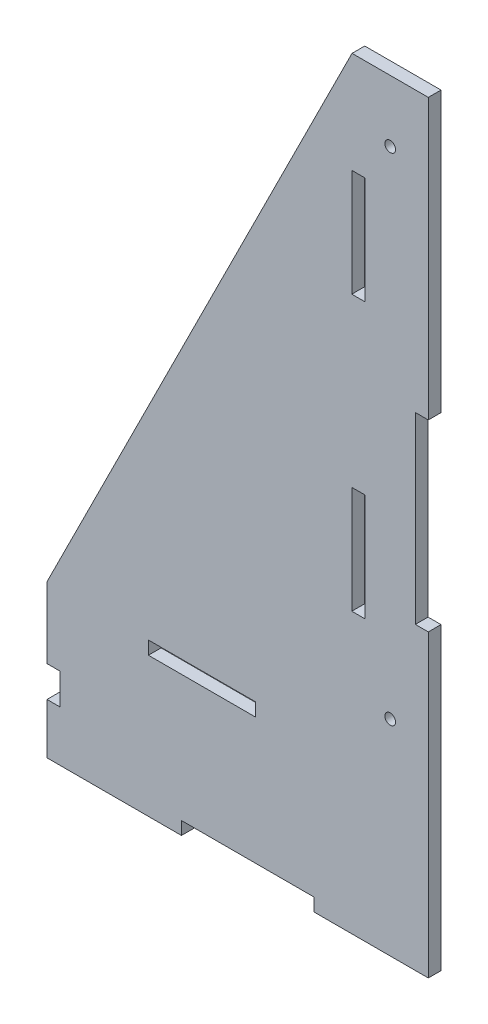
ISO-10303-21;
HEADER;
FILE_DESCRIPTION(('STEP AP214'),'2;1');
FILE_NAME('part.step','',(''),(''),'','','');
FILE_SCHEMA(('AUTOMOTIVE_DESIGN { 1 0 10303 214 1 1 1 1 }'));
ENDSEC;
DATA;
#1=APPLICATION_CONTEXT('core data for automotive mechanical design processes');
#2=APPLICATION_PROTOCOL_DEFINITION('international standard','automotive_design',2000,#1);
#3=PRODUCT_CONTEXT('',#1,'mechanical');
#4=PRODUCT('Part','Part','',(#3));
#5=PRODUCT_RELATED_PRODUCT_CATEGORY('part','',(#4));
#6=PRODUCT_DEFINITION_FORMATION('','',#4);
#7=PRODUCT_DEFINITION_CONTEXT('part definition',#1,'design');
#8=PRODUCT_DEFINITION('design','',#6,#7);
#9=PRODUCT_DEFINITION_SHAPE('','',#8);
#10=(LENGTH_UNIT() NAMED_UNIT(*) SI_UNIT(.MILLI.,.METRE.));
#11=(NAMED_UNIT(*) PLANE_ANGLE_UNIT() SI_UNIT($,.RADIAN.));
#12=(NAMED_UNIT(*) SI_UNIT($,.STERADIAN.) SOLID_ANGLE_UNIT());
#13=UNCERTAINTY_MEASURE_WITH_UNIT(LENGTH_MEASURE(1.E-05),#10,'distance_accuracy_value','');
#14=(GEOMETRIC_REPRESENTATION_CONTEXT(3) GLOBAL_UNCERTAINTY_ASSIGNED_CONTEXT((#13)) GLOBAL_UNIT_ASSIGNED_CONTEXT((#10,
#11,#12)) REPRESENTATION_CONTEXT('',''));
#15=CARTESIAN_POINT('',(0.,0.,0.));
#16=DIRECTION('',(0.,0.,1.));
#17=DIRECTION('',(1.,0.,0.));
#18=AXIS2_PLACEMENT_3D('',#15,#16,#17);
#19=CARTESIAN_POINT('',(0.,0.,5.));
#20=DIRECTION('',(0.,0.,1.));
#21=DIRECTION('',(1.,0.,0.));
#22=AXIS2_PLACEMENT_3D('',#19,#20,#21);
#23=PLANE('',#22);
#24=CARTESIAN_POINT('',(-15.,-24.2230161128112,5.));
#25=DIRECTION('',(0.,0.,1.));
#26=DIRECTION('',(1.,0.,0.));
#27=AXIS2_PLACEMENT_3D('',#24,#25,#26);
#28=CIRCLE('',#27,2.1);
#29=CARTESIAN_POINT('',(-12.9,-24.2230161128112,5.));
#30=VERTEX_POINT('',#29);
#31=EDGE_CURVE('E267',#30,#30,#28,.T.);
#32=ORIENTED_EDGE('',*,*,#31,.F.);
#33=EDGE_LOOP('',(#32));
#34=FACE_BOUND('',#33,.T.);
#35=CARTESIAN_POINT('',(-15.,-219.269594776355,5.));
#36=DIRECTION('',(0.,0.,1.));
#37=DIRECTION('',(1.,0.,0.));
#38=AXIS2_PLACEMENT_3D('',#35,#36,#37);
#39=CIRCLE('',#38,2.1);
#40=CARTESIAN_POINT('',(-12.9,-219.269594776355,5.));
#41=VERTEX_POINT('',#40);
#42=EDGE_CURVE('E271',#41,#41,#39,.T.);
#43=ORIENTED_EDGE('',*,*,#42,.F.);
#44=EDGE_LOOP('',(#43));
#45=FACE_BOUND('',#44,.T.);
#46=CARTESIAN_POINT('',(-110.099999999999,-239.899999999994,4.99999999999873));
#47=CARTESIAN_POINT('',(-110.099999999999,-245.099999999994,4.99999999999873));
#48=B_SPLINE_CURVE_WITH_KNOTS('',1,(#46,#47),.UNSPECIFIED.,.F.,.F.,(2,2),(0.,
0.0548523206751055),.UNSPECIFIED.);
#49=CARTESIAN_POINT('',(-110.099999999999,-239.899999999994,4.99999999999873));
#50=VERTEX_POINT('',#49);
#51=CARTESIAN_POINT('',(-110.099999999999,-245.099999999994,5.));
#52=VERTEX_POINT('',#51);
#53=EDGE_CURVE('E303',#50,#52,#48,.T.);
#54=ORIENTED_EDGE('',*,*,#53,.F.);
#55=CARTESIAN_POINT('',(-67.8999999999994,-239.899999999995,4.99999999999884));
#56=CARTESIAN_POINT('',(-110.099999999999,-239.899999999994,4.99999999999873));
#57=B_SPLINE_CURVE_WITH_KNOTS('',1,(#55,#56),.UNSPECIFIED.,.F.,.F.,(2,2),(0.554852320675105,1.),.UNSPECIFIED.);
#58=CARTESIAN_POINT('',(-67.8999999999994,-239.899999999995,4.99999999999884));
#59=VERTEX_POINT('',#58);
#60=EDGE_CURVE('E338',#59,#50,#57,.T.);
#61=ORIENTED_EDGE('',*,*,#60,.F.);
#62=CARTESIAN_POINT('',(-67.8999999999995,-245.099999999995,4.99999999999884));
#63=CARTESIAN_POINT('',(-67.8999999999994,-239.899999999995,4.99999999999884));
#64=B_SPLINE_CURVE_WITH_KNOTS('',1,(#62,#63),.UNSPECIFIED.,.F.,.F.,(2,2),(0.5,
0.554852320675105),.UNSPECIFIED.);
#65=CARTESIAN_POINT('',(-67.8999999999995,-245.099999999995,4.99999999999884));
#66=VERTEX_POINT('',#65);
#67=EDGE_CURVE('E330',#66,#59,#64,.T.);
#68=ORIENTED_EDGE('',*,*,#67,.F.);
#69=CARTESIAN_POINT('',(-110.099999999999,-245.099999999994,4.99999999999873));
#70=CARTESIAN_POINT('',(-67.8999999999995,-245.099999999995,4.99999999999884));
#71=B_SPLINE_CURVE_WITH_KNOTS('',1,(#69,#70),.UNSPECIFIED.,.F.,.F.,(2,2),(0.0548523206751055,
0.5),.UNSPECIFIED.);
#72=EDGE_CURVE('E322',#52,#66,#71,.T.);
#73=ORIENTED_EDGE('',*,*,#72,.F.);
#74=EDGE_LOOP('',(#54,#61,#68,#73));
#75=FACE_BOUND('',#74,.T.);
#76=CARTESIAN_POINT('',(-30.0999999999972,-82.0999999999957,5.00000000000056));
#77=CARTESIAN_POINT('',(-24.8999999999972,-82.0999999999958,5.00000000000056));
#78=B_SPLINE_CURVE_WITH_KNOTS('',1,(#76,#77),.UNSPECIFIED.,.F.,.F.,(2,2),(0.,
0.0548523206751055),.UNSPECIFIED.);
#79=CARTESIAN_POINT('',(-30.0999999999972,-82.0999999999957,5.00000000000056));
#80=VERTEX_POINT('',#79);
#81=CARTESIAN_POINT('',(-24.8999999999972,-82.0999999999958,5.));
#82=VERTEX_POINT('',#81);
#83=EDGE_CURVE('E368',#80,#82,#78,.T.);
#84=ORIENTED_EDGE('',*,*,#83,.F.);
#85=CARTESIAN_POINT('',(-30.0999999999966,-39.8999999999957,5.00000000000056));
#86=CARTESIAN_POINT('',(-30.0999999999972,-82.0999999999957,5.00000000000056));
#87=B_SPLINE_CURVE_WITH_KNOTS('',1,(#85,#86),.UNSPECIFIED.,.F.,.F.,(2,2),(0.554852320675105,1.),.UNSPECIFIED.);
#88=CARTESIAN_POINT('',(-30.0999999999966,-39.8999999999957,5.00000000000056));
#89=VERTEX_POINT('',#88);
#90=EDGE_CURVE('E389',#89,#80,#87,.T.);
#91=ORIENTED_EDGE('',*,*,#90,.F.);
#92=CARTESIAN_POINT('',(-24.8999999999966,-39.8999999999958,5.00000000000056));
#93=CARTESIAN_POINT('',(-30.0999999999966,-39.8999999999957,5.00000000000056));
#94=B_SPLINE_CURVE_WITH_KNOTS('',1,(#92,#93),.UNSPECIFIED.,.F.,.F.,(2,2),(0.5,
0.554852320675105),.UNSPECIFIED.);
#95=CARTESIAN_POINT('',(-24.8999999999966,-39.8999999999958,5.00000000000056));
#96=VERTEX_POINT('',#95);
#97=EDGE_CURVE('E381',#96,#89,#94,.T.);
#98=ORIENTED_EDGE('',*,*,#97,.F.);
#99=CARTESIAN_POINT('',(-24.8999999999972,-82.0999999999958,5.00000000000056));
#100=CARTESIAN_POINT('',(-24.8999999999966,-39.8999999999958,5.00000000000056));
#101=B_SPLINE_CURVE_WITH_KNOTS('',1,(#99,#100),.UNSPECIFIED.,.F.,.F.,(2,2),(0.0548523206751055,
0.5),.UNSPECIFIED.);
#102=EDGE_CURVE('E372',#82,#96,#101,.T.);
#103=ORIENTED_EDGE('',*,*,#102,.F.);
#104=EDGE_LOOP('',(#84,#91,#98,#103));
#105=FACE_BOUND('',#104,.T.);
#106=CARTESIAN_POINT('',(-30.0999999999987,-190.099999999996,5.00000000000056));
#107=CARTESIAN_POINT('',(-24.8999999999987,-190.099999999996,5.00000000000056));
#108=B_SPLINE_CURVE_WITH_KNOTS('',1,(#106,#107),.UNSPECIFIED.,.F.,.F.,(2,2),(0.,
0.0548523206751055),.UNSPECIFIED.);
#109=CARTESIAN_POINT('',(-30.0999999999987,-190.099999999996,5.00000000000056));
#110=VERTEX_POINT('',#109);
#111=CARTESIAN_POINT('',(-24.8999999999987,-190.099999999996,5.));
#112=VERTEX_POINT('',#111);
#113=EDGE_CURVE('E358',#110,#112,#108,.T.);
#114=ORIENTED_EDGE('',*,*,#113,.F.);
#115=CARTESIAN_POINT('',(-30.0999999999982,-147.899999999996,5.00000000000056));
#116=CARTESIAN_POINT('',(-30.0999999999987,-190.099999999996,5.00000000000056));
#117=B_SPLINE_CURVE_WITH_KNOTS('',1,(#115,#116),.UNSPECIFIED.,.F.,.F.,(2,2),(0.554852320675105,
1.),.UNSPECIFIED.);
#118=CARTESIAN_POINT('',(-30.0999999999982,-147.899999999996,5.00000000000056));
#119=VERTEX_POINT('',#118);
#120=EDGE_CURVE('E437',#119,#110,#117,.T.);
#121=ORIENTED_EDGE('',*,*,#120,.F.);
#122=CARTESIAN_POINT('',(-24.8999999999982,-147.899999999996,5.00000000000056));
#123=CARTESIAN_POINT('',(-30.0999999999982,-147.899999999996,5.00000000000056));
#124=B_SPLINE_CURVE_WITH_KNOTS('',1,(#122,#123),.UNSPECIFIED.,.F.,.F.,(2,2),(0.5,
0.554852320675105),.UNSPECIFIED.);
#125=CARTESIAN_POINT('',(-24.8999999999982,-147.899999999996,5.00000000000056));
#126=VERTEX_POINT('',#125);
#127=EDGE_CURVE('E429',#126,#119,#124,.T.);
#128=ORIENTED_EDGE('',*,*,#127,.F.);
#129=CARTESIAN_POINT('',(-24.8999999999987,-190.099999999996,5.00000000000056));
#130=CARTESIAN_POINT('',(-24.8999999999982,-147.899999999996,5.00000000000056));
#131=B_SPLINE_CURVE_WITH_KNOTS('',1,(#129,#130),.UNSPECIFIED.,.F.,.F.,(2,2),(0.0548523206751055,
0.5),.UNSPECIFIED.);
#132=EDGE_CURVE('E421',#112,#126,#131,.T.);
#133=ORIENTED_EDGE('',*,*,#132,.F.);
#134=EDGE_LOOP('',(#114,#121,#128,#133));
#135=FACE_BOUND('',#134,.T.);
#136=DIRECTION('',(1.,0.,0.));
#137=VECTOR('',#136,1.);
#138=CARTESIAN_POINT('',(-150.,-300.,5.));
#139=LINE('',#138,#137);
#140=CARTESIAN_POINT('',(-150.,-300.,5.));
#141=VERTEX_POINT('',#140);
#142=CARTESIAN_POINT('',(-97.1000000000003,-300.,4.99999999999695));
#143=VERTEX_POINT('',#142);
#144=EDGE_CURVE('E247',#141,#143,#139,.T.);
#145=ORIENTED_EDGE('',*,*,#144,.T.);
#146=CARTESIAN_POINT('',(-97.1000000000003,-300.099999999995,4.99999999999695));
#147=CARTESIAN_POINT('',(-97.1000000000002,-294.899999999995,4.99999999999695));
#148=B_SPLINE_CURVE_WITH_KNOTS('',1,(#146,#147),.UNSPECIFIED.,.F.,.F.,(2,2),(0.5,
0.545296167247387),.UNSPECIFIED.);
#149=CARTESIAN_POINT('',(-97.1000000000002,-294.899999999995,4.99999999999695));
#150=VERTEX_POINT('',#149);
#151=EDGE_CURVE('E229',#143,#150,#148,.T.);
#152=ORIENTED_EDGE('',*,*,#151,.T.);
#153=CARTESIAN_POINT('',(-97.1000000000002,-294.899999999995,4.99999999999695));
#154=CARTESIAN_POINT('',(-44.9000000000002,-294.899999999995,4.99999999999712));
#155=B_SPLINE_CURVE_WITH_KNOTS('',1,(#153,#154),.UNSPECIFIED.,.F.,.F.,(2,2),(0.545296167247387,
1.),.UNSPECIFIED.);
#156=CARTESIAN_POINT('',(-44.9000000000002,-294.899999999995,4.99999999999712));
#157=VERTEX_POINT('',#156);
#158=EDGE_CURVE('E239',#150,#157,#155,.T.);
#159=ORIENTED_EDGE('',*,*,#158,.T.);
#160=CARTESIAN_POINT('',(-44.9000000000002,-294.899999999995,4.99999999999712));
#161=CARTESIAN_POINT('',(-44.9000000000003,-300.099999999995,4.99999999999712));
#162=B_SPLINE_CURVE_WITH_KNOTS('',1,(#160,#161),.UNSPECIFIED.,.F.,.F.,(2,2),(0.,
0.0452961672473868),.UNSPECIFIED.);
#163=CARTESIAN_POINT('',(-44.9000000000003,-300.,4.99999999999712));
#164=VERTEX_POINT('',#163);
#165=EDGE_CURVE('E248',#157,#164,#162,.T.);
#166=ORIENTED_EDGE('',*,*,#165,.T.);
#167=CARTESIAN_POINT('',(0.,-300.,5.));
#168=VERTEX_POINT('',#167);
#169=EDGE_CURVE('E500',#164,#168,#139,.T.);
#170=ORIENTED_EDGE('',*,*,#169,.T.);
#171=DIRECTION('',(0.,1.,0.));
#172=VECTOR('',#171,1.);
#173=CARTESIAN_POINT('',(0.,-300.,5.));
#174=LINE('',#173,#172);
#175=CARTESIAN_POINT('',(0.,-182.1,5.));
#176=VERTEX_POINT('',#175);
#177=EDGE_CURVE('E488',#168,#176,#174,.T.);
#178=ORIENTED_EDGE('',*,*,#177,.T.);
#179=DIRECTION('',(1.,0.,0.));
#180=VECTOR('',#179,1.);
#181=CARTESIAN_POINT('',(-5.10000000000251,-182.1,5.));
#182=LINE('',#181,#180);
#183=CARTESIAN_POINT('',(-5.10000000000253,-182.1,5.00000000000001));
#184=VERTEX_POINT('',#183);
#185=EDGE_CURVE('E58',#184,#176,#182,.T.);
#186=ORIENTED_EDGE('',*,*,#185,.F.);
#187=DIRECTION('',(0.,-1.,0.));
#188=VECTOR('',#187,1.);
#189=CARTESIAN_POINT('',(-5.10000000000152,-109.9,5.));
#190=LINE('',#189,#188);
#191=CARTESIAN_POINT('',(-5.10000000000152,-109.9,5.));
#192=VERTEX_POINT('',#191);
#193=EDGE_CURVE('E304',#192,#184,#190,.T.);
#194=ORIENTED_EDGE('',*,*,#193,.F.);
#195=DIRECTION('',(-1.,0.,0.));
#196=VECTOR('',#195,1.);
#197=CARTESIAN_POINT('',(0.0999999999984988,-109.9,5.));
#198=LINE('',#197,#196);
#199=CARTESIAN_POINT('',(0.,-109.9,5.));
#200=VERTEX_POINT('',#199);
#201=EDGE_CURVE('E279',#200,#192,#198,.T.);
#202=ORIENTED_EDGE('',*,*,#201,.F.);
#203=CARTESIAN_POINT('',(0.,0.,5.));
#204=VERTEX_POINT('',#203);
#205=EDGE_CURVE('E492',#200,#204,#174,.T.);
#206=ORIENTED_EDGE('',*,*,#205,.T.);
#207=DIRECTION('',(-1.,0.,0.));
#208=VECTOR('',#207,1.);
#209=CARTESIAN_POINT('',(0.,0.,5.));
#210=LINE('',#209,#208);
#211=CARTESIAN_POINT('',(-30.,0.,5.));
#212=VERTEX_POINT('',#211);
#213=EDGE_CURVE('E491',#204,#212,#210,.T.);
#214=ORIENTED_EDGE('',*,*,#213,.T.);
#215=DIRECTION('',(-0.447213595499958,-0.894427190999916,0.));
#216=VECTOR('',#215,1.);
#217=CARTESIAN_POINT('',(-30.,0.,5.));
#218=LINE('',#217,#216);
#219=CARTESIAN_POINT('',(-150.,-240.,5.));
#220=VERTEX_POINT('',#219);
#221=EDGE_CURVE('E494',#212,#220,#218,.T.);
#222=ORIENTED_EDGE('',*,*,#221,.T.);
#223=DIRECTION('',(0.,-1.,0.));
#224=VECTOR('',#223,1.);
#225=CARTESIAN_POINT('',(-150.,-240.,5.));
#226=LINE('',#225,#224);
#227=CARTESIAN_POINT('',(-150.,-267.899999999994,5.00000000000002));
#228=VERTEX_POINT('',#227);
#229=EDGE_CURVE('E497',#220,#228,#226,.T.);
#230=ORIENTED_EDGE('',*,*,#229,.T.);
#231=DIRECTION('',(-1.,0.,0.));
#232=VECTOR('',#231,1.);
#233=CARTESIAN_POINT('',(-144.9,-267.899999999994,5.00000000000002));
#234=LINE('',#233,#232);
#235=CARTESIAN_POINT('',(-144.9,-267.899999999994,5.00000000000001));
#236=VERTEX_POINT('',#235);
#237=EDGE_CURVE('E472',#236,#228,#234,.T.);
#238=ORIENTED_EDGE('',*,*,#237,.F.);
#239=DIRECTION('',(0.,1.,0.));
#240=VECTOR('',#239,1.);
#241=CARTESIAN_POINT('',(-144.9,-280.099999999994,5.00000000000002));
#242=LINE('',#241,#240);
#243=CARTESIAN_POINT('',(-144.9,-280.099999999994,5.00000000000002));
#244=VERTEX_POINT('',#243);
#245=EDGE_CURVE('E478',#244,#236,#242,.T.);
#246=ORIENTED_EDGE('',*,*,#245,.F.);
#247=DIRECTION('',(1.,0.,0.));
#248=VECTOR('',#247,1.);
#249=CARTESIAN_POINT('',(-150.1,-280.099999999994,5.00000000000002));
#250=LINE('',#249,#248);
#251=CARTESIAN_POINT('',(-150.,-280.099999999994,5.00000000000002));
#252=VERTEX_POINT('',#251);
#253=EDGE_CURVE('E462',#252,#244,#250,.T.);
#254=ORIENTED_EDGE('',*,*,#253,.F.);
#255=EDGE_CURVE('E496',#252,#141,#226,.T.);
#256=ORIENTED_EDGE('',*,*,#255,.T.);
#257=EDGE_LOOP('',(#145,#152,#159,#166,#170,#178,#186,#194,#202,#206,#214,#222,#230,#238,#246,
#254,#256));
#258=FACE_BOUND('',#257,.T.);
#259=ADVANCED_FACE('F35',(#34,#45,#75,#105,#135,#258),#23,.T.);
#260=CARTESIAN_POINT('',(0.,0.,0.));
#261=DIRECTION('',(0.,0.,1.));
#262=DIRECTION('',(1.,0.,0.));
#263=AXIS2_PLACEMENT_3D('',#260,#261,#262);
#264=PLANE('',#263);
#265=DIRECTION('',(1.,0.,0.));
#266=VECTOR('',#265,1.);
#267=CARTESIAN_POINT('',(-67.8999999999994,-239.899999999995,0.));
#268=LINE('',#267,#266);
#269=CARTESIAN_POINT('',(-110.099999999999,-239.899999999994,0.));
#270=VERTEX_POINT('',#269);
#271=CARTESIAN_POINT('',(-67.8999999999994,-239.899999999995,0.));
#272=VERTEX_POINT('',#271);
#273=EDGE_CURVE('E313',#270,#272,#268,.T.);
#274=ORIENTED_EDGE('',*,*,#273,.F.);
#275=DIRECTION('',(0.,1.,0.));
#276=VECTOR('',#275,1.);
#277=CARTESIAN_POINT('',(-110.099999999999,-239.899999999994,0.));
#278=LINE('',#277,#276);
#279=CARTESIAN_POINT('',(-110.099999999999,-245.099999999994,0.));
#280=VERTEX_POINT('',#279);
#281=EDGE_CURVE('E316',#280,#270,#278,.T.);
#282=ORIENTED_EDGE('',*,*,#281,.F.);
#283=DIRECTION('',(-1.,0.,0.));
#284=VECTOR('',#283,1.);
#285=CARTESIAN_POINT('',(-110.099999999999,-245.099999999994,0.));
#286=LINE('',#285,#284);
#287=CARTESIAN_POINT('',(-67.8999999999995,-245.099999999995,0.));
#288=VERTEX_POINT('',#287);
#289=EDGE_CURVE('E318',#288,#280,#286,.T.);
#290=ORIENTED_EDGE('',*,*,#289,.F.);
#291=DIRECTION('',(0.,-1.,0.));
#292=VECTOR('',#291,1.);
#293=CARTESIAN_POINT('',(-67.8999999999995,-245.099999999995,0.));
#294=LINE('',#293,#292);
#295=EDGE_CURVE('E310',#272,#288,#294,.T.);
#296=ORIENTED_EDGE('',*,*,#295,.F.);
#297=EDGE_LOOP('',(#274,#282,#290,#296));
#298=FACE_BOUND('',#297,.T.);
#299=DIRECTION('',(0.,1.,0.));
#300=VECTOR('',#299,1.);
#301=CARTESIAN_POINT('',(-30.0999999999966,-39.8999999999957,0.));
#302=LINE('',#301,#300);
#303=CARTESIAN_POINT('',(-30.0999999999972,-82.0999999999957,0.));
#304=VERTEX_POINT('',#303);
#305=CARTESIAN_POINT('',(-30.0999999999966,-39.8999999999957,0.));
#306=VERTEX_POINT('',#305);
#307=EDGE_CURVE('E362',#304,#306,#302,.T.);
#308=ORIENTED_EDGE('',*,*,#307,.F.);
#309=DIRECTION('',(-1.,0.,0.));
#310=VECTOR('',#309,1.);
#311=CARTESIAN_POINT('',(-30.0999999999972,-82.0999999999957,0.));
#312=LINE('',#311,#310);
#313=CARTESIAN_POINT('',(-24.8999999999972,-82.0999999999958,0.));
#314=VERTEX_POINT('',#313);
#315=EDGE_CURVE('E365',#314,#304,#312,.T.);
#316=ORIENTED_EDGE('',*,*,#315,.F.);
#317=DIRECTION('',(0.,-1.,0.));
#318=VECTOR('',#317,1.);
#319=CARTESIAN_POINT('',(-24.8999999999972,-82.0999999999958,0.));
#320=LINE('',#319,#318);
#321=CARTESIAN_POINT('',(-24.8999999999966,-39.8999999999958,0.));
#322=VERTEX_POINT('',#321);
#323=EDGE_CURVE('E367',#322,#314,#320,.T.);
#324=ORIENTED_EDGE('',*,*,#323,.F.);
#325=DIRECTION('',(1.,0.,0.));
#326=VECTOR('',#325,1.);
#327=CARTESIAN_POINT('',(-24.8999999999966,-39.8999999999958,0.));
#328=LINE('',#327,#326);
#329=EDGE_CURVE('E359',#306,#322,#328,.T.);
#330=ORIENTED_EDGE('',*,*,#329,.F.);
#331=EDGE_LOOP('',(#308,#316,#324,#330));
#332=FACE_BOUND('',#331,.T.);
#333=DIRECTION('',(0.,1.,0.));
#334=VECTOR('',#333,1.);
#335=CARTESIAN_POINT('',(-30.0999999999981,-147.899999999996,0.));
#336=LINE('',#335,#334);
#337=CARTESIAN_POINT('',(-30.0999999999987,-190.099999999996,0.));
#338=VERTEX_POINT('',#337);
#339=CARTESIAN_POINT('',(-30.0999999999981,-147.899999999996,0.));
#340=VERTEX_POINT('',#339);
#341=EDGE_CURVE('E413',#338,#340,#336,.T.);
#342=ORIENTED_EDGE('',*,*,#341,.F.);
#343=DIRECTION('',(-1.,0.,0.));
#344=VECTOR('',#343,1.);
#345=CARTESIAN_POINT('',(-30.0999999999987,-190.099999999996,0.));
#346=LINE('',#345,#344);
#347=CARTESIAN_POINT('',(-24.8999999999987,-190.099999999996,0.));
#348=VERTEX_POINT('',#347);
#349=EDGE_CURVE('E416',#348,#338,#346,.T.);
#350=ORIENTED_EDGE('',*,*,#349,.F.);
#351=DIRECTION('',(0.,-1.,0.));
#352=VECTOR('',#351,1.);
#353=CARTESIAN_POINT('',(-24.8999999999987,-190.099999999996,0.));
#354=LINE('',#353,#352);
#355=CARTESIAN_POINT('',(-24.8999999999981,-147.899999999996,0.));
#356=VERTEX_POINT('',#355);
#357=EDGE_CURVE('E373',#356,#348,#354,.T.);
#358=ORIENTED_EDGE('',*,*,#357,.F.);
#359=DIRECTION('',(1.,0.,0.));
#360=VECTOR('',#359,1.);
#361=CARTESIAN_POINT('',(-24.8999999999981,-147.899999999996,0.));
#362=LINE('',#361,#360);
#363=EDGE_CURVE('E410',#340,#356,#362,.T.);
#364=ORIENTED_EDGE('',*,*,#363,.F.);
#365=EDGE_LOOP('',(#342,#350,#358,#364));
#366=FACE_BOUND('',#365,.T.);
#367=CARTESIAN_POINT('',(-15.,-219.269594776355,0.));
#368=DIRECTION('',(0.,0.,1.));
#369=DIRECTION('',(1.,0.,0.));
#370=AXIS2_PLACEMENT_3D('',#367,#368,#369);
#371=CIRCLE('',#370,2.1);
#372=CARTESIAN_POINT('',(-12.9,-219.269594776355,0.));
#373=VERTEX_POINT('',#372);
#374=EDGE_CURVE('E270',#373,#373,#371,.T.);
#375=ORIENTED_EDGE('',*,*,#374,.T.);
#376=EDGE_LOOP('',(#375));
#377=FACE_BOUND('',#376,.T.);
#378=CARTESIAN_POINT('',(-15.,-24.2230161128112,0.));
#379=DIRECTION('',(0.,0.,1.));
#380=DIRECTION('',(1.,0.,0.));
#381=AXIS2_PLACEMENT_3D('',#378,#379,#380);
#382=CIRCLE('',#381,2.1);
#383=CARTESIAN_POINT('',(-12.9,-24.2230161128112,0.));
#384=VERTEX_POINT('',#383);
#385=EDGE_CURVE('E298',#384,#384,#382,.T.);
#386=ORIENTED_EDGE('',*,*,#385,.T.);
#387=EDGE_LOOP('',(#386));
#388=FACE_BOUND('',#387,.T.);
#389=DIRECTION('',(0.,-1.,0.));
#390=VECTOR('',#389,1.);
#391=CARTESIAN_POINT('',(-97.1000000000003,-300.099999999995,0.));
#392=LINE('',#391,#390);
#393=CARTESIAN_POINT('',(-97.1000000000002,-294.899999999995,0.));
#394=VERTEX_POINT('',#393);
#395=CARTESIAN_POINT('',(-97.1000000000003,-300.,0.));
#396=VERTEX_POINT('',#395);
#397=EDGE_CURVE('E232',#394,#396,#392,.T.);
#398=ORIENTED_EDGE('',*,*,#397,.T.);
#399=DIRECTION('',(1.,0.,0.));
#400=VECTOR('',#399,1.);
#401=CARTESIAN_POINT('',(-150.,-300.,0.));
#402=LINE('',#401,#400);
#403=CARTESIAN_POINT('',(-150.,-300.,0.));
#404=VERTEX_POINT('',#403);
#405=EDGE_CURVE('E515',#404,#396,#402,.T.);
#406=ORIENTED_EDGE('',*,*,#405,.F.);
#407=DIRECTION('',(0.,-1.,0.));
#408=VECTOR('',#407,1.);
#409=CARTESIAN_POINT('',(-150.,-240.,0.));
#410=LINE('',#409,#408);
#411=CARTESIAN_POINT('',(-150.,-280.099999999994,-1.86379850117281E-12));
#412=VERTEX_POINT('',#411);
#413=EDGE_CURVE('E510',#412,#404,#410,.T.);
#414=ORIENTED_EDGE('',*,*,#413,.F.);
#415=DIRECTION('',(-1.,0.,0.));
#416=VECTOR('',#415,1.);
#417=CARTESIAN_POINT('',(-3.91185569203979E-12,-280.099999999996,0.));
#418=LINE('',#417,#416);
#419=CARTESIAN_POINT('',(-144.9,-280.099999999994,-1.88098048613335E-12));
#420=VERTEX_POINT('',#419);
#421=EDGE_CURVE('E532',#420,#412,#418,.T.);
#422=ORIENTED_EDGE('',*,*,#421,.F.);
#423=CARTESIAN_POINT('',(-144.9,-280.099999999994,-1.88098048613335E-12));
#424=CARTESIAN_POINT('',(-144.9,-267.899999999994,-1.88098048613335E-12));
#425=B_SPLINE_CURVE_WITH_KNOTS('',1,(#423,#424),.UNSPECIFIED.,.F.,.F.,(2,2),(0.149425287356322,
0.5),.UNSPECIFIED.);
#426=CARTESIAN_POINT('',(-144.9,-267.899999999994,-1.88098048613335E-12));
#427=VERTEX_POINT('',#426);
#428=EDGE_CURVE('E464',#420,#427,#425,.T.);
#429=ORIENTED_EDGE('',*,*,#428,.T.);
#430=CARTESIAN_POINT('',(-144.9,-267.899999999994,-1.88098048613335E-12));
#431=CARTESIAN_POINT('',(-150.1,-267.899999999994,-1.86346159950692E-12));
#432=B_SPLINE_CURVE_WITH_KNOTS('',1,(#430,#431),.UNSPECIFIED.,.F.,.F.,(2,2),(0.5,
0.649425287356322),.UNSPECIFIED.);
#433=CARTESIAN_POINT('',(-150.,-267.899999999994,0.));
#434=VERTEX_POINT('',#433);
#435=EDGE_CURVE('E457',#427,#434,#432,.T.);
#436=ORIENTED_EDGE('',*,*,#435,.T.);
#437=CARTESIAN_POINT('',(-150.,-240.,0.));
#438=VERTEX_POINT('',#437);
#439=EDGE_CURVE('E511',#438,#434,#410,.T.);
#440=ORIENTED_EDGE('',*,*,#439,.F.);
#441=DIRECTION('',(-0.447213595499958,-0.894427190999916,0.));
#442=VECTOR('',#441,1.);
#443=CARTESIAN_POINT('',(-30.,0.,0.));
#444=LINE('',#443,#442);
#445=CARTESIAN_POINT('',(-30.,0.,0.));
#446=VERTEX_POINT('',#445);
#447=EDGE_CURVE('E508',#446,#438,#444,.T.);
#448=ORIENTED_EDGE('',*,*,#447,.F.);
#449=DIRECTION('',(-1.,0.,0.));
#450=VECTOR('',#449,1.);
#451=CARTESIAN_POINT('',(0.,0.,0.));
#452=LINE('',#451,#450);
#453=CARTESIAN_POINT('',(0.,0.,0.));
#454=VERTEX_POINT('',#453);
#455=EDGE_CURVE('E506',#454,#446,#452,.T.);
#456=ORIENTED_EDGE('',*,*,#455,.F.);
#457=DIRECTION('',(0.,1.,0.));
#458=VECTOR('',#457,1.);
#459=CARTESIAN_POINT('',(0.,-300.,0.));
#460=LINE('',#459,#458);
#461=CARTESIAN_POINT('',(0.,-109.9,0.));
#462=VERTEX_POINT('',#461);
#463=EDGE_CURVE('E487',#462,#454,#460,.T.);
#464=ORIENTED_EDGE('',*,*,#463,.F.);
#465=CARTESIAN_POINT('',(0.0999999999984651,-109.9,0.));
#466=CARTESIAN_POINT('',(-5.10000000000153,-109.9,0.));
#467=B_SPLINE_CURVE_WITH_KNOTS('',1,(#465,#466),.UNSPECIFIED.,.F.,.F.,(2,2),(0.,
0.0335917312661499),.UNSPECIFIED.);
#468=CARTESIAN_POINT('',(-5.10000000000153,-109.9,0.));
#469=VERTEX_POINT('',#468);
#470=EDGE_CURVE('E290',#462,#469,#467,.T.);
#471=ORIENTED_EDGE('',*,*,#470,.T.);
#472=CARTESIAN_POINT('',(-5.10000000000153,-109.9,0.));
#473=CARTESIAN_POINT('',(-5.10000000000254,-182.1,0.));
#474=B_SPLINE_CURVE_WITH_KNOTS('',1,(#472,#473),.UNSPECIFIED.,.F.,.F.,(2,2),(0.0335917312661499,
0.5),.UNSPECIFIED.);
#475=CARTESIAN_POINT('',(-5.10000000000254,-182.1,0.));
#476=VERTEX_POINT('',#475);
#477=EDGE_CURVE('E281',#469,#476,#474,.T.);
#478=ORIENTED_EDGE('',*,*,#477,.T.);
#479=CARTESIAN_POINT('',(-5.10000000000254,-182.1,0.));
#480=CARTESIAN_POINT('',(0.0999999999974568,-182.1,0.));
#481=B_SPLINE_CURVE_WITH_KNOTS('',1,(#479,#480),.UNSPECIFIED.,.F.,.F.,(2,2),(0.5,
0.53359173126615),.UNSPECIFIED.);
#482=CARTESIAN_POINT('',(0.,-182.1,0.));
#483=VERTEX_POINT('',#482);
#484=EDGE_CURVE('E274',#476,#483,#481,.T.);
#485=ORIENTED_EDGE('',*,*,#484,.T.);
#486=CARTESIAN_POINT('',(0.,-300.,0.));
#487=VERTEX_POINT('',#486);
#488=EDGE_CURVE('E503',#487,#483,#460,.T.);
#489=ORIENTED_EDGE('',*,*,#488,.F.);
#490=CARTESIAN_POINT('',(-44.9000000000002,-300.,0.));
#491=VERTEX_POINT('',#490);
#492=EDGE_CURVE('E514',#491,#487,#402,.T.);
#493=ORIENTED_EDGE('',*,*,#492,.F.);
#494=DIRECTION('',(0.,1.,0.));
#495=VECTOR('',#494,1.);
#496=CARTESIAN_POINT('',(-44.9000000000002,-294.899999999995,0.));
#497=LINE('',#496,#495);
#498=CARTESIAN_POINT('',(-44.9000000000002,-294.899999999995,0.));
#499=VERTEX_POINT('',#498);
#500=EDGE_CURVE('E50',#491,#499,#497,.T.);
#501=ORIENTED_EDGE('',*,*,#500,.T.);
#502=DIRECTION('',(-1.,0.,0.));
#503=VECTOR('',#502,1.);
#504=CARTESIAN_POINT('',(-97.1000000000002,-294.899999999995,0.));
#505=LINE('',#504,#503);
#506=EDGE_CURVE('E235',#499,#394,#505,.T.);
#507=ORIENTED_EDGE('',*,*,#506,.T.);
#508=EDGE_LOOP('',(#398,#406,#414,#422,#429,#436,#440,#448,#456,#464,#471,#478,#485,#489,#493,
#501,#507));
#509=FACE_BOUND('',#508,.T.);
#510=ADVANCED_FACE('F567',(#298,#332,#366,#377,#388,#509),#264,.F.);
#511=CARTESIAN_POINT('',(-150.,-300.,5.));
#512=DIRECTION('',(0.,1.,0.));
#513=DIRECTION('',(0.,0.,1.));
#514=AXIS2_PLACEMENT_3D('',#511,#512,#513);
#515=PLANE('',#514);
#516=DIRECTION('',(0.,0.,-1.));
#517=VECTOR('',#516,1.);
#518=CARTESIAN_POINT('',(-97.1000000000003,-300.,5.00000000000021));
#519=LINE('',#518,#517);
#520=EDGE_CURVE('E11',#143,#396,#519,.T.);
#521=ORIENTED_EDGE('',*,*,#520,.F.);
#522=ORIENTED_EDGE('',*,*,#144,.F.);
#523=DIRECTION('',(0.,0.,-1.));
#524=VECTOR('',#523,1.);
#525=CARTESIAN_POINT('',(-150.,-300.,5.));
#526=LINE('',#525,#524);
#527=EDGE_CURVE('E520',#141,#404,#526,.T.);
#528=ORIENTED_EDGE('',*,*,#527,.T.);
#529=ORIENTED_EDGE('',*,*,#405,.T.);
#530=EDGE_LOOP('',(#521,#522,#528,#529));
#531=FACE_BOUND('',#530,.T.);
#532=ADVANCED_FACE('F602',(#531),#515,.F.);
#533=DIRECTION('',(0.,0.,1.));
#534=VECTOR('',#533,1.);
#535=CARTESIAN_POINT('',(-44.9000000000003,-300.,5.00000000000042));
#536=LINE('',#535,#534);
#537=EDGE_CURVE('E43',#491,#164,#536,.T.);
#538=ORIENTED_EDGE('',*,*,#537,.F.);
#539=ORIENTED_EDGE('',*,*,#492,.T.);
#540=DIRECTION('',(0.,0.,-1.));
#541=VECTOR('',#540,1.);
#542=CARTESIAN_POINT('',(0.,-300.,5.));
#543=LINE('',#542,#541);
#544=EDGE_CURVE('E502',#168,#487,#543,.T.);
#545=ORIENTED_EDGE('',*,*,#544,.F.);
#546=ORIENTED_EDGE('',*,*,#169,.F.);
#547=EDGE_LOOP('',(#538,#539,#545,#546));
#548=FACE_BOUND('',#547,.T.);
#549=ADVANCED_FACE('F546',(#548),#515,.F.);
#550=CARTESIAN_POINT('',(0.,-300.,5.));
#551=DIRECTION('',(-1.,0.,0.));
#552=DIRECTION('',(0.,0.,1.));
#553=AXIS2_PLACEMENT_3D('',#550,#551,#552);
#554=PLANE('',#553);
#555=DIRECTION('',(0.,0.,1.));
#556=VECTOR('',#555,1.);
#557=CARTESIAN_POINT('',(0.,-109.9,4.99999999999998));
#558=LINE('',#557,#556);
#559=EDGE_CURVE('E536',#462,#200,#558,.T.);
#560=ORIENTED_EDGE('',*,*,#559,.F.);
#561=ORIENTED_EDGE('',*,*,#463,.T.);
#562=DIRECTION('',(0.,0.,-1.));
#563=VECTOR('',#562,1.);
#564=CARTESIAN_POINT('',(0.,0.,5.));
#565=LINE('',#564,#563);
#566=EDGE_CURVE('E529',#204,#454,#565,.T.);
#567=ORIENTED_EDGE('',*,*,#566,.F.);
#568=ORIENTED_EDGE('',*,*,#205,.F.);
#569=EDGE_LOOP('',(#560,#561,#567,#568));
#570=FACE_BOUND('',#569,.T.);
#571=ADVANCED_FACE('F37',(#570),#554,.F.);
#572=DIRECTION('',(0.,0.,-1.));
#573=VECTOR('',#572,1.);
#574=CARTESIAN_POINT('',(0.,-182.1,4.99999999999999));
#575=LINE('',#574,#573);
#576=EDGE_CURVE('E534',#176,#483,#575,.T.);
#577=ORIENTED_EDGE('',*,*,#576,.F.);
#578=ORIENTED_EDGE('',*,*,#177,.F.);
#579=ORIENTED_EDGE('',*,*,#544,.T.);
#580=ORIENTED_EDGE('',*,*,#488,.T.);
#581=EDGE_LOOP('',(#577,#578,#579,#580));
#582=FACE_BOUND('',#581,.T.);
#583=ADVANCED_FACE('F550',(#582),#554,.F.);
#584=CARTESIAN_POINT('',(-150.,-240.,5.));
#585=DIRECTION('',(1.,0.,0.));
#586=DIRECTION('',(0.,0.,-1.));
#587=AXIS2_PLACEMENT_3D('',#584,#585,#586);
#588=PLANE('',#587);
#589=DIRECTION('',(0.,0.,1.));
#590=VECTOR('',#589,1.);
#591=CARTESIAN_POINT('',(-150.,-280.099999999994,5.00000000000001));
#592=LINE('',#591,#590);
#593=EDGE_CURVE('E485',#412,#252,#592,.T.);
#594=ORIENTED_EDGE('',*,*,#593,.F.);
#595=ORIENTED_EDGE('',*,*,#413,.T.);
#596=ORIENTED_EDGE('',*,*,#527,.F.);
#597=ORIENTED_EDGE('',*,*,#255,.F.);
#598=EDGE_LOOP('',(#594,#595,#596,#597));
#599=FACE_BOUND('',#598,.T.);
#600=ADVANCED_FACE('F599',(#599),#588,.F.);
#601=DIRECTION('',(0.,0.,-1.));
#602=VECTOR('',#601,1.);
#603=CARTESIAN_POINT('',(-150.,-267.899999999994,5.));
#604=LINE('',#603,#602);
#605=EDGE_CURVE('E477',#228,#434,#604,.T.);
#606=ORIENTED_EDGE('',*,*,#605,.F.);
#607=ORIENTED_EDGE('',*,*,#229,.F.);
#608=DIRECTION('',(0.,0.,-1.));
#609=VECTOR('',#608,1.);
#610=CARTESIAN_POINT('',(-150.,-240.,5.));
#611=LINE('',#610,#609);
#612=EDGE_CURVE('E523',#220,#438,#611,.T.);
#613=ORIENTED_EDGE('',*,*,#612,.T.);
#614=ORIENTED_EDGE('',*,*,#439,.T.);
#615=EDGE_LOOP('',(#606,#607,#613,#614));
#616=FACE_BOUND('',#615,.T.);
#617=ADVANCED_FACE('F582',(#616),#588,.F.);
#618=CARTESIAN_POINT('',(0.,0.,5.));
#619=DIRECTION('',(0.,-1.,0.));
#620=DIRECTION('',(1.,0.,0.));
#621=AXIS2_PLACEMENT_3D('',#618,#619,#620);
#622=PLANE('',#621);
#623=ORIENTED_EDGE('',*,*,#455,.T.);
#624=DIRECTION('',(0.,0.,-1.));
#625=VECTOR('',#624,1.);
#626=CARTESIAN_POINT('',(-30.,0.,5.));
#627=LINE('',#626,#625);
#628=EDGE_CURVE('E526',#212,#446,#627,.T.);
#629=ORIENTED_EDGE('',*,*,#628,.F.);
#630=ORIENTED_EDGE('',*,*,#213,.F.);
#631=ORIENTED_EDGE('',*,*,#566,.T.);
#632=EDGE_LOOP('',(#623,#629,#630,#631));
#633=FACE_BOUND('',#632,.T.);
#634=ADVANCED_FACE('F573',(#633),#622,.F.);
#635=CARTESIAN_POINT('',(-30.,0.,5.));
#636=DIRECTION('',(0.894427190999916,-0.447213595499958,0.));
#637=DIRECTION('',(0.447213595499958,0.894427190999916,0.));
#638=AXIS2_PLACEMENT_3D('',#635,#636,#637);
#639=PLANE('',#638);
#640=ORIENTED_EDGE('',*,*,#447,.T.);
#641=ORIENTED_EDGE('',*,*,#612,.F.);
#642=ORIENTED_EDGE('',*,*,#221,.F.);
#643=ORIENTED_EDGE('',*,*,#628,.T.);
#644=EDGE_LOOP('',(#640,#641,#642,#643));
#645=FACE_BOUND('',#644,.T.);
#646=ADVANCED_FACE('F579',(#645),#639,.F.);
#647=CARTESIAN_POINT('',(-150.1,-280.099999999994,9.99999999999547));
#648=DIRECTION('',(0.,1.,0.));
#649=DIRECTION('',(0.,0.,-1.));
#650=AXIS2_PLACEMENT_3D('',#647,#648,#649);
#651=PLANE('',#650);
#652=ORIENTED_EDGE('',*,*,#593,.T.);
#653=ORIENTED_EDGE('',*,*,#253,.T.);
#654=DIRECTION('',(0.,0.,-1.));
#655=VECTOR('',#654,1.);
#656=CARTESIAN_POINT('',(-144.9,-280.099999999994,9.99999999999546));
#657=LINE('',#656,#655);
#658=EDGE_CURVE('E409',#244,#420,#657,.T.);
#659=ORIENTED_EDGE('',*,*,#658,.T.);
#660=ORIENTED_EDGE('',*,*,#421,.T.);
#661=EDGE_LOOP('',(#652,#653,#659,#660));
#662=FACE_BOUND('',#661,.T.);
#663=ADVANCED_FACE('F627',(#662),#651,.T.);
#664=CARTESIAN_POINT('',(-144.9,-267.899999999994,9.99999999999546));
#665=DIRECTION('',(0.,-1.,0.));
#666=DIRECTION('',(0.,0.,1.));
#667=AXIS2_PLACEMENT_3D('',#664,#665,#666);
#668=PLANE('',#667);
#669=ORIENTED_EDGE('',*,*,#605,.T.);
#670=ORIENTED_EDGE('',*,*,#435,.F.);
#671=DIRECTION('',(0.,0.,-1.));
#672=VECTOR('',#671,1.);
#673=CARTESIAN_POINT('',(-144.9,-267.899999999994,9.99999999999546));
#674=LINE('',#673,#672);
#675=EDGE_CURVE('E463',#236,#427,#674,.T.);
#676=ORIENTED_EDGE('',*,*,#675,.F.);
#677=ORIENTED_EDGE('',*,*,#237,.T.);
#678=EDGE_LOOP('',(#669,#670,#676,#677));
#679=FACE_BOUND('',#678,.T.);
#680=ADVANCED_FACE('F585',(#679),#668,.T.);
#681=CARTESIAN_POINT('',(-144.9,-280.099999999994,9.99999999999546));
#682=DIRECTION('',(-1.,0.,0.));
#683=DIRECTION('',(0.,0.,1.));
#684=AXIS2_PLACEMENT_3D('',#681,#682,#683);
#685=PLANE('',#684);
#686=ORIENTED_EDGE('',*,*,#245,.T.);
#687=ORIENTED_EDGE('',*,*,#675,.T.);
#688=ORIENTED_EDGE('',*,*,#428,.F.);
#689=ORIENTED_EDGE('',*,*,#658,.F.);
#690=EDGE_LOOP('',(#686,#687,#688,#689));
#691=FACE_BOUND('',#690,.T.);
#692=ADVANCED_FACE('F591',(#691),#685,.T.);
#693=CARTESIAN_POINT('',(-30.0999999999987,-190.099999999996,-5.00000000000056));
#694=DIRECTION('',(0.,-1.,0.));
#695=DIRECTION('',(0.,0.,1.));
#696=AXIS2_PLACEMENT_3D('',#693,#694,#695);
#697=PLANE('',#696);
#698=ORIENTED_EDGE('',*,*,#349,.T.);
#699=DIRECTION('',(0.,0.,1.));
#700=VECTOR('',#699,1.);
#701=CARTESIAN_POINT('',(-30.0999999999987,-190.099999999996,-5.00000000000056));
#702=LINE('',#701,#700);
#703=EDGE_CURVE('E414',#338,#110,#702,.T.);
#704=ORIENTED_EDGE('',*,*,#703,.T.);
#705=ORIENTED_EDGE('',*,*,#113,.T.);
#706=DIRECTION('',(0.,0.,1.));
#707=VECTOR('',#706,1.);
#708=CARTESIAN_POINT('',(-24.8999999999987,-190.099999999996,-5.00000000000056));
#709=LINE('',#708,#707);
#710=EDGE_CURVE('E445',#348,#112,#709,.T.);
#711=ORIENTED_EDGE('',*,*,#710,.F.);
#712=EDGE_LOOP('',(#698,#704,#705,#711));
#713=FACE_BOUND('',#712,.T.);
#714=ADVANCED_FACE('F800',(#713),#697,.F.);
#715=CARTESIAN_POINT('',(-30.0999999999981,-147.899999999996,-5.00000000000056));
#716=DIRECTION('',(-1.,0.,0.));
#717=DIRECTION('',(0.,0.,1.));
#718=AXIS2_PLACEMENT_3D('',#715,#716,#717);
#719=PLANE('',#718);
#720=ORIENTED_EDGE('',*,*,#341,.T.);
#721=DIRECTION('',(0.,0.,1.));
#722=VECTOR('',#721,1.);
#723=CARTESIAN_POINT('',(-30.0999999999981,-147.899999999996,-5.00000000000056));
#724=LINE('',#723,#722);
#725=EDGE_CURVE('E450',#340,#119,#724,.T.);
#726=ORIENTED_EDGE('',*,*,#725,.T.);
#727=ORIENTED_EDGE('',*,*,#120,.T.);
#728=ORIENTED_EDGE('',*,*,#703,.F.);
#729=EDGE_LOOP('',(#720,#726,#727,#728));
#730=FACE_BOUND('',#729,.T.);
#731=ADVANCED_FACE('F792',(#730),#719,.F.);
#732=CARTESIAN_POINT('',(-24.8999999999981,-147.899999999996,-5.00000000000056));
#733=DIRECTION('',(0.,1.,0.));
#734=DIRECTION('',(0.,0.,-1.));
#735=AXIS2_PLACEMENT_3D('',#732,#733,#734);
#736=PLANE('',#735);
#737=ORIENTED_EDGE('',*,*,#363,.T.);
#738=DIRECTION('',(0.,0.,1.));
#739=VECTOR('',#738,1.);
#740=CARTESIAN_POINT('',(-24.8999999999981,-147.899999999996,-5.00000000000056));
#741=LINE('',#740,#739);
#742=EDGE_CURVE('E452',#356,#126,#741,.T.);
#743=ORIENTED_EDGE('',*,*,#742,.T.);
#744=ORIENTED_EDGE('',*,*,#127,.T.);
#745=ORIENTED_EDGE('',*,*,#725,.F.);
#746=EDGE_LOOP('',(#737,#743,#744,#745));
#747=FACE_BOUND('',#746,.T.);
#748=ADVANCED_FACE('F784',(#747),#736,.F.);
#749=CARTESIAN_POINT('',(-24.8999999999987,-190.099999999996,-5.00000000000056));
#750=DIRECTION('',(1.,0.,0.));
#751=DIRECTION('',(0.,0.,-1.));
#752=AXIS2_PLACEMENT_3D('',#749,#750,#751);
#753=PLANE('',#752);
#754=ORIENTED_EDGE('',*,*,#357,.T.);
#755=ORIENTED_EDGE('',*,*,#710,.T.);
#756=ORIENTED_EDGE('',*,*,#132,.T.);
#757=ORIENTED_EDGE('',*,*,#742,.F.);
#758=EDGE_LOOP('',(#754,#755,#756,#757));
#759=FACE_BOUND('',#758,.T.);
#760=ADVANCED_FACE('F776',(#759),#753,.F.);
#761=CARTESIAN_POINT('',(-30.0999999999972,-82.0999999999957,-5.00000000000056));
#762=DIRECTION('',(0.,-1.,0.));
#763=DIRECTION('',(0.,0.,1.));
#764=AXIS2_PLACEMENT_3D('',#761,#762,#763);
#765=PLANE('',#764);
#766=ORIENTED_EDGE('',*,*,#315,.T.);
#767=DIRECTION('',(0.,0.,1.));
#768=VECTOR('',#767,1.);
#769=CARTESIAN_POINT('',(-30.0999999999972,-82.0999999999957,-5.00000000000056));
#770=LINE('',#769,#768);
#771=EDGE_CURVE('E363',#304,#80,#770,.T.);
#772=ORIENTED_EDGE('',*,*,#771,.T.);
#773=ORIENTED_EDGE('',*,*,#83,.T.);
#774=DIRECTION('',(0.,0.,1.));
#775=VECTOR('',#774,1.);
#776=CARTESIAN_POINT('',(-24.8999999999972,-82.0999999999958,-5.00000000000056));
#777=LINE('',#776,#775);
#778=EDGE_CURVE('E397',#314,#82,#777,.T.);
#779=ORIENTED_EDGE('',*,*,#778,.F.);
#780=EDGE_LOOP('',(#766,#772,#773,#779));
#781=FACE_BOUND('',#780,.T.);
#782=ADVANCED_FACE('F768',(#781),#765,.F.);
#783=CARTESIAN_POINT('',(-30.0999999999966,-39.8999999999957,-5.00000000000056));
#784=DIRECTION('',(-1.,0.,0.));
#785=DIRECTION('',(0.,0.,1.));
#786=AXIS2_PLACEMENT_3D('',#783,#784,#785);
#787=PLANE('',#786);
#788=ORIENTED_EDGE('',*,*,#307,.T.);
#789=DIRECTION('',(0.,0.,1.));
#790=VECTOR('',#789,1.);
#791=CARTESIAN_POINT('',(-30.0999999999966,-39.8999999999957,-5.00000000000056));
#792=LINE('',#791,#790);
#793=EDGE_CURVE('E402',#306,#89,#792,.T.);
#794=ORIENTED_EDGE('',*,*,#793,.T.);
#795=ORIENTED_EDGE('',*,*,#90,.T.);
#796=ORIENTED_EDGE('',*,*,#771,.F.);
#797=EDGE_LOOP('',(#788,#794,#795,#796));
#798=FACE_BOUND('',#797,.T.);
#799=ADVANCED_FACE('F760',(#798),#787,.F.);
#800=CARTESIAN_POINT('',(-24.8999999999966,-39.8999999999958,-5.00000000000056));
#801=DIRECTION('',(0.,1.,0.));
#802=DIRECTION('',(0.,0.,-1.));
#803=AXIS2_PLACEMENT_3D('',#800,#801,#802);
#804=PLANE('',#803);
#805=ORIENTED_EDGE('',*,*,#329,.T.);
#806=DIRECTION('',(0.,0.,1.));
#807=VECTOR('',#806,1.);
#808=CARTESIAN_POINT('',(-24.8999999999966,-39.8999999999958,-5.00000000000056));
#809=LINE('',#808,#807);
#810=EDGE_CURVE('E404',#322,#96,#809,.T.);
#811=ORIENTED_EDGE('',*,*,#810,.T.);
#812=ORIENTED_EDGE('',*,*,#97,.T.);
#813=ORIENTED_EDGE('',*,*,#793,.F.);
#814=EDGE_LOOP('',(#805,#811,#812,#813));
#815=FACE_BOUND('',#814,.T.);
#816=ADVANCED_FACE('F752',(#815),#804,.F.);
#817=CARTESIAN_POINT('',(-24.8999999999972,-82.0999999999958,-5.00000000000056));
#818=DIRECTION('',(1.,0.,0.));
#819=DIRECTION('',(0.,0.,-1.));
#820=AXIS2_PLACEMENT_3D('',#817,#818,#819);
#821=PLANE('',#820);
#822=ORIENTED_EDGE('',*,*,#323,.T.);
#823=ORIENTED_EDGE('',*,*,#778,.T.);
#824=ORIENTED_EDGE('',*,*,#102,.T.);
#825=ORIENTED_EDGE('',*,*,#810,.F.);
#826=EDGE_LOOP('',(#822,#823,#824,#825));
#827=FACE_BOUND('',#826,.T.);
#828=ADVANCED_FACE('F744',(#827),#821,.F.);
#829=CARTESIAN_POINT('',(-110.099999999999,-239.899999999994,-4.99999999999895));
#830=DIRECTION('',(-1.,0.,0.));
#831=DIRECTION('',(0.,0.,1.));
#832=AXIS2_PLACEMENT_3D('',#829,#830,#831);
#833=PLANE('',#832);
#834=ORIENTED_EDGE('',*,*,#281,.T.);
#835=DIRECTION('',(0.,0.,1.));
#836=VECTOR('',#835,1.);
#837=CARTESIAN_POINT('',(-110.099999999999,-239.899999999994,-4.99999999999895));
#838=LINE('',#837,#836);
#839=EDGE_CURVE('E314',#270,#50,#838,.T.);
#840=ORIENTED_EDGE('',*,*,#839,.T.);
#841=ORIENTED_EDGE('',*,*,#53,.T.);
#842=DIRECTION('',(0.,0.,1.));
#843=VECTOR('',#842,1.);
#844=CARTESIAN_POINT('',(-110.099999999999,-245.099999999994,-4.99999999999895));
#845=LINE('',#844,#843);
#846=EDGE_CURVE('E346',#280,#52,#845,.T.);
#847=ORIENTED_EDGE('',*,*,#846,.F.);
#848=EDGE_LOOP('',(#834,#840,#841,#847));
#849=FACE_BOUND('',#848,.T.);
#850=ADVANCED_FACE('F736',(#849),#833,.F.);
#851=CARTESIAN_POINT('',(-67.8999999999994,-239.899999999995,-4.99999999999884));
#852=DIRECTION('',(0.,1.,0.));
#853=DIRECTION('',(-1.,0.,0.));
#854=AXIS2_PLACEMENT_3D('',#851,#852,#853);
#855=PLANE('',#854);
#856=ORIENTED_EDGE('',*,*,#273,.T.);
#857=DIRECTION('',(0.,0.,1.));
#858=VECTOR('',#857,1.);
#859=CARTESIAN_POINT('',(-67.8999999999994,-239.899999999995,-4.99999999999884));
#860=LINE('',#859,#858);
#861=EDGE_CURVE('E351',#272,#59,#860,.T.);
#862=ORIENTED_EDGE('',*,*,#861,.T.);
#863=ORIENTED_EDGE('',*,*,#60,.T.);
#864=ORIENTED_EDGE('',*,*,#839,.F.);
#865=EDGE_LOOP('',(#856,#862,#863,#864));
#866=FACE_BOUND('',#865,.T.);
#867=ADVANCED_FACE('F728',(#866),#855,.F.);
#868=CARTESIAN_POINT('',(-67.8999999999995,-245.099999999995,-4.99999999999884));
#869=DIRECTION('',(1.,0.,0.));
#870=DIRECTION('',(0.,0.,-1.));
#871=AXIS2_PLACEMENT_3D('',#868,#869,#870);
#872=PLANE('',#871);
#873=ORIENTED_EDGE('',*,*,#295,.T.);
#874=DIRECTION('',(0.,0.,1.));
#875=VECTOR('',#874,1.);
#876=CARTESIAN_POINT('',(-67.8999999999995,-245.099999999995,-4.99999999999884));
#877=LINE('',#876,#875);
#878=EDGE_CURVE('E353',#288,#66,#877,.T.);
#879=ORIENTED_EDGE('',*,*,#878,.T.);
#880=ORIENTED_EDGE('',*,*,#67,.T.);
#881=ORIENTED_EDGE('',*,*,#861,.F.);
#882=EDGE_LOOP('',(#873,#879,#880,#881));
#883=FACE_BOUND('',#882,.T.);
#884=ADVANCED_FACE('F720',(#883),#872,.F.);
#885=CARTESIAN_POINT('',(-110.099999999999,-245.099999999994,-4.99999999999895));
#886=DIRECTION('',(0.,-1.,0.));
#887=DIRECTION('',(1.,0.,0.));
#888=AXIS2_PLACEMENT_3D('',#885,#886,#887);
#889=PLANE('',#888);
#890=ORIENTED_EDGE('',*,*,#289,.T.);
#891=ORIENTED_EDGE('',*,*,#846,.T.);
#892=ORIENTED_EDGE('',*,*,#72,.T.);
#893=ORIENTED_EDGE('',*,*,#878,.F.);
#894=EDGE_LOOP('',(#890,#891,#892,#893));
#895=FACE_BOUND('',#894,.T.);
#896=ADVANCED_FACE('F613',(#895),#889,.F.);
#897=CARTESIAN_POINT('',(0.0999999999984988,-109.9,9.99999999954891));
#898=DIRECTION('',(0.,-1.,0.));
#899=DIRECTION('',(0.,0.,1.));
#900=AXIS2_PLACEMENT_3D('',#897,#898,#899);
#901=PLANE('',#900);
#902=ORIENTED_EDGE('',*,*,#559,.T.);
#903=ORIENTED_EDGE('',*,*,#201,.T.);
#904=DIRECTION('',(0.,0.,-1.));
#905=VECTOR('',#904,1.);
#906=CARTESIAN_POINT('',(-5.1000000000015,-109.9,9.99999999954893));
#907=LINE('',#906,#905);
#908=EDGE_CURVE('E289',#192,#469,#907,.T.);
#909=ORIENTED_EDGE('',*,*,#908,.T.);
#910=ORIENTED_EDGE('',*,*,#470,.F.);
#911=EDGE_LOOP('',(#902,#903,#909,#910));
#912=FACE_BOUND('',#911,.T.);
#913=ADVANCED_FACE('F560',(#912),#901,.T.);
#914=CARTESIAN_POINT('',(-5.10000000000251,-182.1,9.99999999954893));
#915=DIRECTION('',(0.,1.,0.));
#916=DIRECTION('',(0.,0.,-1.));
#917=AXIS2_PLACEMENT_3D('',#914,#915,#916);
#918=PLANE('',#917);
#919=ORIENTED_EDGE('',*,*,#576,.T.);
#920=ORIENTED_EDGE('',*,*,#484,.F.);
#921=DIRECTION('',(0.,0.,-1.));
#922=VECTOR('',#921,1.);
#923=CARTESIAN_POINT('',(-5.10000000000251,-182.1,9.99999999954893));
#924=LINE('',#923,#922);
#925=EDGE_CURVE('E280',#184,#476,#924,.T.);
#926=ORIENTED_EDGE('',*,*,#925,.F.);
#927=ORIENTED_EDGE('',*,*,#185,.T.);
#928=EDGE_LOOP('',(#919,#920,#926,#927));
#929=FACE_BOUND('',#928,.T.);
#930=ADVANCED_FACE('F604',(#929),#918,.T.);
#931=CARTESIAN_POINT('',(-5.1000000000015,-109.9,9.99999999954893));
#932=DIRECTION('',(1.,0.,0.));
#933=DIRECTION('',(0.,0.,-1.));
#934=AXIS2_PLACEMENT_3D('',#931,#932,#933);
#935=PLANE('',#934);
#936=ORIENTED_EDGE('',*,*,#193,.T.);
#937=ORIENTED_EDGE('',*,*,#925,.T.);
#938=ORIENTED_EDGE('',*,*,#477,.F.);
#939=ORIENTED_EDGE('',*,*,#908,.F.);
#940=EDGE_LOOP('',(#936,#937,#938,#939));
#941=FACE_BOUND('',#940,.T.);
#942=ADVANCED_FACE('F556',(#941),#935,.T.);
#943=CARTESIAN_POINT('',(-15.,-219.269594776355,-5.));
#944=DIRECTION('',(0.,0.,1.));
#945=DIRECTION('',(1.,0.,0.));
#946=AXIS2_PLACEMENT_3D('',#943,#944,#945);
#947=CYLINDRICAL_SURFACE('',#946,2.1);
#948=ORIENTED_EDGE('',*,*,#42,.T.);
#949=EDGE_LOOP('',(#948));
#950=FACE_BOUND('',#949,.T.);
#951=ORIENTED_EDGE('',*,*,#374,.F.);
#952=EDGE_LOOP('',(#951));
#953=FACE_BOUND('',#952,.T.);
#954=ADVANCED_FACE('F611',(#950,#953),#947,.F.);
#955=CARTESIAN_POINT('',(-15.,-24.2230161128112,-5.));
#956=DIRECTION('',(0.,0.,1.));
#957=DIRECTION('',(1.,0.,0.));
#958=AXIS2_PLACEMENT_3D('',#955,#956,#957);
#959=CYLINDRICAL_SURFACE('',#958,2.1);
#960=ORIENTED_EDGE('',*,*,#31,.T.);
#961=EDGE_LOOP('',(#960));
#962=FACE_BOUND('',#961,.T.);
#963=ORIENTED_EDGE('',*,*,#385,.F.);
#964=EDGE_LOOP('',(#963));
#965=FACE_BOUND('',#964,.T.);
#966=ADVANCED_FACE('F683',(#962,#965),#959,.F.);
#967=CARTESIAN_POINT('',(-97.1000000000002,-300.099999999995,-4.99999999999706));
#968=DIRECTION('',(1.,0.,0.));
#969=DIRECTION('',(0.,0.,-1.));
#970=AXIS2_PLACEMENT_3D('',#967,#968,#969);
#971=PLANE('',#970);
#972=ORIENTED_EDGE('',*,*,#520,.T.);
#973=ORIENTED_EDGE('',*,*,#397,.F.);
#974=DIRECTION('',(0.,0.,1.));
#975=VECTOR('',#974,1.);
#976=CARTESIAN_POINT('',(-97.1000000000002,-294.899999999995,-4.99999999999706));
#977=LINE('',#976,#975);
#978=EDGE_CURVE('E225',#394,#150,#977,.T.);
#979=ORIENTED_EDGE('',*,*,#978,.T.);
#980=ORIENTED_EDGE('',*,*,#151,.F.);
#981=EDGE_LOOP('',(#972,#973,#979,#980));
#982=FACE_BOUND('',#981,.T.);
#983=ADVANCED_FACE('F227',(#982),#971,.T.);
#984=CARTESIAN_POINT('',(-44.9000000000002,-294.899999999995,-4.9999999999969));
#985=DIRECTION('',(-1.,0.,0.));
#986=DIRECTION('',(0.,0.,1.));
#987=AXIS2_PLACEMENT_3D('',#984,#985,#986);
#988=PLANE('',#987);
#989=ORIENTED_EDGE('',*,*,#537,.T.);
#990=ORIENTED_EDGE('',*,*,#165,.F.);
#991=DIRECTION('',(0.,0.,1.));
#992=VECTOR('',#991,1.);
#993=CARTESIAN_POINT('',(-44.9000000000002,-294.899999999995,-4.9999999999969));
#994=LINE('',#993,#992);
#995=EDGE_CURVE('E236',#499,#157,#994,.T.);
#996=ORIENTED_EDGE('',*,*,#995,.F.);
#997=ORIENTED_EDGE('',*,*,#500,.F.);
#998=EDGE_LOOP('',(#989,#990,#996,#997));
#999=FACE_BOUND('',#998,.T.);
#1000=ADVANCED_FACE('F541',(#999),#988,.T.);
#1001=CARTESIAN_POINT('',(-97.1000000000002,-294.899999999995,-4.99999999999706));
#1002=DIRECTION('',(0.,-1.,0.));
#1003=DIRECTION('',(0.,0.,-1.));
#1004=AXIS2_PLACEMENT_3D('',#1001,#1002,#1003);
#1005=PLANE('',#1004);
#1006=ORIENTED_EDGE('',*,*,#995,.T.);
#1007=ORIENTED_EDGE('',*,*,#158,.F.);
#1008=ORIENTED_EDGE('',*,*,#978,.F.);
#1009=ORIENTED_EDGE('',*,*,#506,.F.);
#1010=EDGE_LOOP('',(#1006,#1007,#1008,#1009));
#1011=FACE_BOUND('',#1010,.T.);
#1012=ADVANCED_FACE('F240',(#1011),#1005,.T.);
#1013=CLOSED_SHELL('',(#259,#510,#532,#549,#571,#583,#600,#617,#634,#646,#663,#680,#692,#714,
#731,#748,#760,#782,#799,#816,#828,#850,#867,#884,#896,#913,#930,#942,#954,#966,#983,#1000,#1012));
#1014=MANIFOLD_SOLID_BREP('B2',#1013);
#1015=ADVANCED_BREP_SHAPE_REPRESENTATION('',(#18,#1014),#14);
#1016=SHAPE_DEFINITION_REPRESENTATION(#9,#1015);
ENDSEC;
END-ISO-10303-21;
